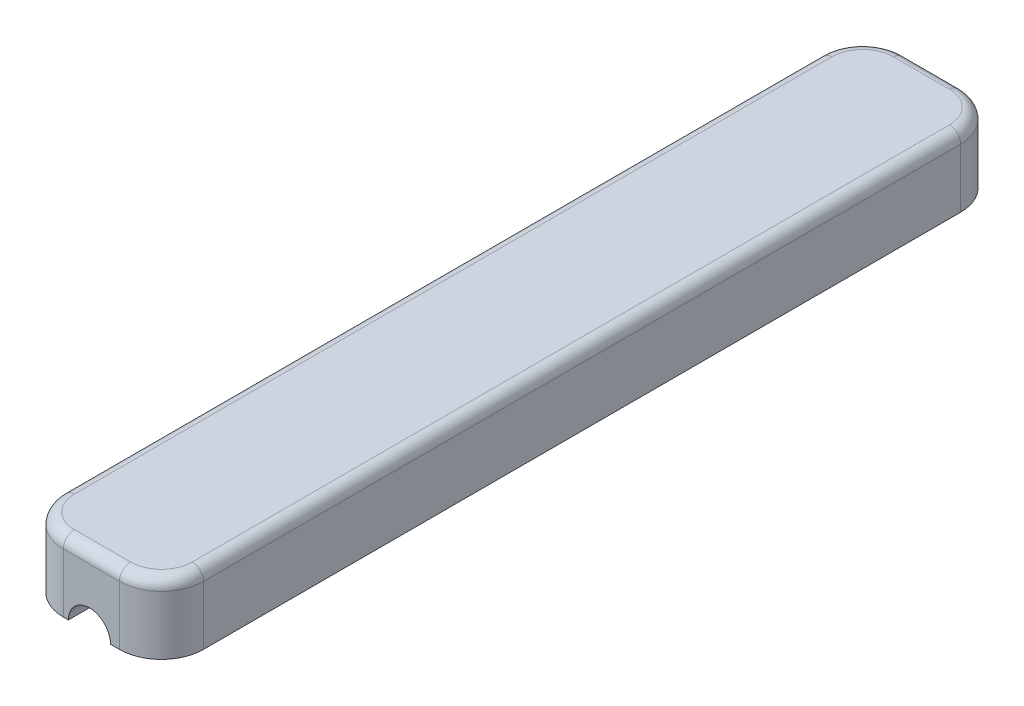
ISO-10303-21;
HEADER;
FILE_DESCRIPTION(('STEP AP214'),'2;1');
FILE_NAME('part.step','',(''),(''),'','','');
FILE_SCHEMA(('AUTOMOTIVE_DESIGN { 1 0 10303 214 1 1 1 1 }'));
ENDSEC;
DATA;
#1=APPLICATION_CONTEXT('core data for automotive mechanical design processes');
#2=APPLICATION_PROTOCOL_DEFINITION('international standard','automotive_design',2000,#1);
#3=PRODUCT_CONTEXT('',#1,'mechanical');
#4=PRODUCT('Part','Part','',(#3));
#5=PRODUCT_RELATED_PRODUCT_CATEGORY('part','',(#4));
#6=PRODUCT_DEFINITION_FORMATION('','',#4);
#7=PRODUCT_DEFINITION_CONTEXT('part definition',#1,'design');
#8=PRODUCT_DEFINITION('design','',#6,#7);
#9=PRODUCT_DEFINITION_SHAPE('','',#8);
#10=(LENGTH_UNIT() NAMED_UNIT(*) SI_UNIT(.MILLI.,.METRE.));
#11=(NAMED_UNIT(*) PLANE_ANGLE_UNIT() SI_UNIT($,.RADIAN.));
#12=(NAMED_UNIT(*) SI_UNIT($,.STERADIAN.) SOLID_ANGLE_UNIT());
#13=UNCERTAINTY_MEASURE_WITH_UNIT(LENGTH_MEASURE(1.E-05),#10,'distance_accuracy_value','');
#14=(GEOMETRIC_REPRESENTATION_CONTEXT(3) GLOBAL_UNCERTAINTY_ASSIGNED_CONTEXT((#13)) GLOBAL_UNIT_ASSIGNED_CONTEXT((#10,
#11,#12)) REPRESENTATION_CONTEXT('',''));
#15=CARTESIAN_POINT('',(0.,0.,0.));
#16=DIRECTION('',(0.,0.,1.));
#17=DIRECTION('',(1.,0.,0.));
#18=AXIS2_PLACEMENT_3D('',#15,#16,#17);
#19=CARTESIAN_POINT('',(50.,-12.5,150.));
#20=DIRECTION('',(0.,1.,0.));
#21=DIRECTION('',(0.,0.,1.));
#22=AXIS2_PLACEMENT_3D('',#19,#20,#21);
#23=PLANE('',#22);
#24=DIRECTION('',(-1.,0.,0.));
#25=VECTOR('',#24,1.);
#26=CARTESIAN_POINT('',(50.,-12.5,-150.));
#27=LINE('',#26,#25);
#28=CARTESIAN_POINT('',(16.8239431368066,-12.5,-150.));
#29=VERTEX_POINT('',#28);
#30=CARTESIAN_POINT('',(15.,-12.5,-150.));
#31=VERTEX_POINT('',#30);
#32=EDGE_CURVE('E174',#29,#31,#27,.T.);
#33=ORIENTED_EDGE('',*,*,#32,.F.);
#34=DIRECTION('',(0.,0.,1.));
#35=VECTOR('',#34,1.);
#36=CARTESIAN_POINT('',(16.8239431368066,-12.5,-150.));
#37=LINE('',#36,#35);
#38=CARTESIAN_POINT('',(16.8239431368066,-12.5,150.));
#39=VERTEX_POINT('',#38);
#40=EDGE_CURVE('E151',#29,#39,#37,.T.);
#41=ORIENTED_EDGE('',*,*,#40,.T.);
#42=DIRECTION('',(-1.,0.,0.));
#43=VECTOR('',#42,1.);
#44=CARTESIAN_POINT('',(50.,-12.5,150.));
#45=LINE('',#44,#43);
#46=CARTESIAN_POINT('',(15.,-12.5,150.));
#47=VERTEX_POINT('',#46);
#48=EDGE_CURVE('E73',#39,#47,#45,.T.);
#49=ORIENTED_EDGE('',*,*,#48,.T.);
#50=CARTESIAN_POINT('',(15.,-12.5,135.));
#51=DIRECTION('',(0.,1.,0.));
#52=DIRECTION('',(0.,0.,1.));
#53=AXIS2_PLACEMENT_3D('',#50,#51,#52);
#54=CIRCLE('',#53,15.);
#55=CARTESIAN_POINT('',(0.,-12.5,135.));
#56=VERTEX_POINT('',#55);
#57=EDGE_CURVE('E264',#47,#56,#54,.F.);
#58=ORIENTED_EDGE('',*,*,#57,.T.);
#59=DIRECTION('',(0.,0.,-1.));
#60=VECTOR('',#59,1.);
#61=CARTESIAN_POINT('',(0.,-12.5,150.));
#62=LINE('',#61,#60);
#63=CARTESIAN_POINT('',(0.,-12.5,-135.));
#64=VERTEX_POINT('',#63);
#65=EDGE_CURVE('E286',#56,#64,#62,.T.);
#66=ORIENTED_EDGE('',*,*,#65,.T.);
#67=CARTESIAN_POINT('',(15.,-12.5,-135.));
#68=DIRECTION('',(0.,1.,0.));
#69=DIRECTION('',(0.,0.,1.));
#70=AXIS2_PLACEMENT_3D('',#67,#68,#69);
#71=CIRCLE('',#70,15.);
#72=EDGE_CURVE('E270',#64,#31,#71,.F.);
#73=ORIENTED_EDGE('',*,*,#72,.T.);
#74=EDGE_LOOP('',(#33,#41,#49,#58,#66,#73));
#75=FACE_BOUND('',#74,.T.);
#76=ADVANCED_FACE('F47',(#75),#23,.F.);
#77=CARTESIAN_POINT('',(50.,12.5,150.));
#78=DIRECTION('',(0.,1.,0.));
#79=DIRECTION('',(0.,0.,1.));
#80=AXIS2_PLACEMENT_3D('',#77,#78,#79);
#81=PLANE('',#80);
#82=CARTESIAN_POINT('',(35.,12.5,135.));
#83=DIRECTION('',(0.,1.,0.));
#84=DIRECTION('',(0.,0.,1.));
#85=AXIS2_PLACEMENT_3D('',#82,#83,#84);
#86=CIRCLE('',#85,11.);
#87=CARTESIAN_POINT('',(46.,12.5,135.));
#88=VERTEX_POINT('',#87);
#89=CARTESIAN_POINT('',(35.,12.5,146.));
#90=VERTEX_POINT('',#89);
#91=EDGE_CURVE('E228',#88,#90,#86,.F.);
#92=ORIENTED_EDGE('',*,*,#91,.F.);
#93=DIRECTION('',(0.,0.,-1.));
#94=VECTOR('',#93,1.);
#95=CARTESIAN_POINT('',(46.,12.5,150.));
#96=LINE('',#95,#94);
#97=CARTESIAN_POINT('',(46.,12.5,-135.));
#98=VERTEX_POINT('',#97);
#99=EDGE_CURVE('E173',#88,#98,#96,.T.);
#100=ORIENTED_EDGE('',*,*,#99,.T.);
#101=CARTESIAN_POINT('',(35.,12.5,-135.));
#102=DIRECTION('',(0.,1.,0.));
#103=DIRECTION('',(0.,0.,1.));
#104=AXIS2_PLACEMENT_3D('',#101,#102,#103);
#105=CIRCLE('',#104,11.);
#106=CARTESIAN_POINT('',(35.,12.5,-146.));
#107=VERTEX_POINT('',#106);
#108=EDGE_CURVE('E221',#107,#98,#105,.F.);
#109=ORIENTED_EDGE('',*,*,#108,.F.);
#110=DIRECTION('',(-1.,0.,0.));
#111=VECTOR('',#110,1.);
#112=CARTESIAN_POINT('',(0.,12.5,-146.));
#113=LINE('',#112,#111);
#114=CARTESIAN_POINT('',(15.,12.5,-146.));
#115=VERTEX_POINT('',#114);
#116=EDGE_CURVE('E187',#107,#115,#113,.T.);
#117=ORIENTED_EDGE('',*,*,#116,.T.);
#118=CARTESIAN_POINT('',(15.,12.5,-135.));
#119=DIRECTION('',(0.,1.,0.));
#120=DIRECTION('',(0.,0.,1.));
#121=AXIS2_PLACEMENT_3D('',#118,#119,#120);
#122=CIRCLE('',#121,11.);
#123=CARTESIAN_POINT('',(4.,12.5,-135.));
#124=VERTEX_POINT('',#123);
#125=EDGE_CURVE('E217',#124,#115,#122,.F.);
#126=ORIENTED_EDGE('',*,*,#125,.F.);
#127=DIRECTION('',(0.,0.,-1.));
#128=VECTOR('',#127,1.);
#129=CARTESIAN_POINT('',(4.,12.5,150.));
#130=LINE('',#129,#128);
#131=CARTESIAN_POINT('',(4.,12.5,135.));
#132=VERTEX_POINT('',#131);
#133=EDGE_CURVE('E191',#124,#132,#130,.F.);
#134=ORIENTED_EDGE('',*,*,#133,.T.);
#135=CARTESIAN_POINT('',(15.,12.5,135.));
#136=DIRECTION('',(0.,1.,0.));
#137=DIRECTION('',(0.,0.,1.));
#138=AXIS2_PLACEMENT_3D('',#135,#136,#137);
#139=CIRCLE('',#138,11.);
#140=CARTESIAN_POINT('',(15.,12.5,146.));
#141=VERTEX_POINT('',#140);
#142=EDGE_CURVE('E224',#141,#132,#139,.F.);
#143=ORIENTED_EDGE('',*,*,#142,.F.);
#144=DIRECTION('',(-1.,0.,0.));
#145=VECTOR('',#144,1.);
#146=CARTESIAN_POINT('',(50.,12.5,146.));
#147=LINE('',#146,#145);
#148=EDGE_CURVE('E179',#141,#90,#147,.F.);
#149=ORIENTED_EDGE('',*,*,#148,.T.);
#150=EDGE_LOOP('',(#92,#100,#109,#117,#126,#134,#143,#149));
#151=FACE_BOUND('',#150,.T.);
#152=ADVANCED_FACE('F329',(#151),#81,.T.);
#153=CARTESIAN_POINT('',(35.,-12.5,150.));
#154=VERTEX_POINT('',#153);
#155=CARTESIAN_POINT('',(31.8239431368066,-12.5,150.));
#156=VERTEX_POINT('',#155);
#157=EDGE_CURVE('E165',#154,#156,#45,.T.);
#158=ORIENTED_EDGE('',*,*,#157,.T.);
#159=DIRECTION('',(0.,0.,1.));
#160=VECTOR('',#159,1.);
#161=CARTESIAN_POINT('',(31.8239431368066,-12.5,-150.));
#162=LINE('',#161,#160);
#163=CARTESIAN_POINT('',(31.8239431368066,-12.5,-150.));
#164=VERTEX_POINT('',#163);
#165=EDGE_CURVE('E65',#156,#164,#162,.F.);
#166=ORIENTED_EDGE('',*,*,#165,.T.);
#167=CARTESIAN_POINT('',(35.,-12.5,-150.));
#168=VERTEX_POINT('',#167);
#169=EDGE_CURVE('E162',#168,#164,#27,.T.);
#170=ORIENTED_EDGE('',*,*,#169,.F.);
#171=CARTESIAN_POINT('',(35.,-12.5,-135.));
#172=DIRECTION('',(0.,1.,0.));
#173=DIRECTION('',(0.,0.,1.));
#174=AXIS2_PLACEMENT_3D('',#171,#172,#173);
#175=CIRCLE('',#174,15.);
#176=CARTESIAN_POINT('',(50.,-12.5,-135.));
#177=VERTEX_POINT('',#176);
#178=EDGE_CURVE('E267',#168,#177,#175,.F.);
#179=ORIENTED_EDGE('',*,*,#178,.T.);
#180=DIRECTION('',(0.,0.,-1.));
#181=VECTOR('',#180,1.);
#182=CARTESIAN_POINT('',(50.,-12.5,150.));
#183=LINE('',#182,#181);
#184=CARTESIAN_POINT('',(50.,-12.5,135.));
#185=VERTEX_POINT('',#184);
#186=EDGE_CURVE('E305',#185,#177,#183,.T.);
#187=ORIENTED_EDGE('',*,*,#186,.F.);
#188=CARTESIAN_POINT('',(35.,-12.5,135.));
#189=DIRECTION('',(0.,1.,0.));
#190=DIRECTION('',(0.,0.,1.));
#191=AXIS2_PLACEMENT_3D('',#188,#189,#190);
#192=CIRCLE('',#191,15.);
#193=EDGE_CURVE('E261',#185,#154,#192,.F.);
#194=ORIENTED_EDGE('',*,*,#193,.T.);
#195=EDGE_LOOP('',(#158,#166,#170,#179,#187,#194));
#196=FACE_BOUND('',#195,.T.);
#197=ADVANCED_FACE('F161',(#196),#23,.F.);
#198=CARTESIAN_POINT('',(50.,-12.5,-150.));
#199=DIRECTION('',(0.,0.,1.));
#200=DIRECTION('',(1.,0.,0.));
#201=AXIS2_PLACEMENT_3D('',#198,#199,#200);
#202=PLANE('',#201);
#203=ORIENTED_EDGE('',*,*,#169,.T.);
#204=CARTESIAN_POINT('',(24.3239431368066,-12.5,-150.));
#205=DIRECTION('',(0.,0.,1.));
#206=DIRECTION('',(1.,0.,0.));
#207=AXIS2_PLACEMENT_3D('',#204,#205,#206);
#208=CIRCLE('',#207,7.5);
#209=EDGE_CURVE('E149',#164,#29,#208,.T.);
#210=ORIENTED_EDGE('',*,*,#209,.T.);
#211=ORIENTED_EDGE('',*,*,#32,.T.);
#212=DIRECTION('',(0.,1.,0.));
#213=VECTOR('',#212,1.);
#214=CARTESIAN_POINT('',(15.,-12.5,-150.));
#215=LINE('',#214,#213);
#216=CARTESIAN_POINT('',(15.,8.5,-150.));
#217=VERTEX_POINT('',#216);
#218=EDGE_CURVE('E252',#31,#217,#215,.T.);
#219=ORIENTED_EDGE('',*,*,#218,.T.);
#220=DIRECTION('',(-1.,0.,0.));
#221=VECTOR('',#220,1.);
#222=CARTESIAN_POINT('',(50.,8.5,-150.));
#223=LINE('',#222,#221);
#224=CARTESIAN_POINT('',(35.,8.5,-150.));
#225=VERTEX_POINT('',#224);
#226=EDGE_CURVE('E195',#217,#225,#223,.F.);
#227=ORIENTED_EDGE('',*,*,#226,.T.);
#228=DIRECTION('',(0.,1.,0.));
#229=VECTOR('',#228,1.);
#230=CARTESIAN_POINT('',(35.,-12.5,-150.));
#231=LINE('',#230,#229);
#232=EDGE_CURVE('E171',#225,#168,#231,.F.);
#233=ORIENTED_EDGE('',*,*,#232,.T.);
#234=EDGE_LOOP('',(#203,#210,#211,#219,#227,#233));
#235=FACE_BOUND('',#234,.T.);
#236=ADVANCED_FACE('F168',(#235),#202,.F.);
#237=CARTESIAN_POINT('',(50.,-12.5,150.));
#238=DIRECTION('',(0.,0.,1.));
#239=DIRECTION('',(1.,0.,0.));
#240=AXIS2_PLACEMENT_3D('',#237,#238,#239);
#241=PLANE('',#240);
#242=CARTESIAN_POINT('',(24.3239431368066,-12.5,150.));
#243=DIRECTION('',(0.,0.,1.));
#244=DIRECTION('',(1.,0.,0.));
#245=AXIS2_PLACEMENT_3D('',#242,#243,#244);
#246=CIRCLE('',#245,7.5);
#247=EDGE_CURVE('E156',#156,#39,#246,.T.);
#248=ORIENTED_EDGE('',*,*,#247,.F.);
#249=ORIENTED_EDGE('',*,*,#157,.F.);
#250=DIRECTION('',(0.,1.,0.));
#251=VECTOR('',#250,1.);
#252=CARTESIAN_POINT('',(35.,-12.5,150.));
#253=LINE('',#252,#251);
#254=CARTESIAN_POINT('',(35.,8.5,150.));
#255=VERTEX_POINT('',#254);
#256=EDGE_CURVE('E57',#154,#255,#253,.T.);
#257=ORIENTED_EDGE('',*,*,#256,.T.);
#258=DIRECTION('',(-1.,0.,0.));
#259=VECTOR('',#258,1.);
#260=CARTESIAN_POINT('',(50.,8.5,150.));
#261=LINE('',#260,#259);
#262=CARTESIAN_POINT('',(15.,8.5,150.));
#263=VERTEX_POINT('',#262);
#264=EDGE_CURVE('E198',#255,#263,#261,.T.);
#265=ORIENTED_EDGE('',*,*,#264,.T.);
#266=DIRECTION('',(0.,1.,0.));
#267=VECTOR('',#266,1.);
#268=CARTESIAN_POINT('',(15.,-12.5,150.));
#269=LINE('',#268,#267);
#270=EDGE_CURVE('E11',#263,#47,#269,.F.);
#271=ORIENTED_EDGE('',*,*,#270,.T.);
#272=ORIENTED_EDGE('',*,*,#48,.F.);
#273=EDGE_LOOP('',(#248,#249,#257,#265,#271,#272));
#274=FACE_BOUND('',#273,.T.);
#275=ADVANCED_FACE('F376',(#274),#241,.T.);
#276=CARTESIAN_POINT('',(50.,0.,0.));
#277=DIRECTION('',(1.,0.,0.));
#278=DIRECTION('',(0.,0.,-1.));
#279=AXIS2_PLACEMENT_3D('',#276,#277,#278);
#280=PLANE('',#279);
#281=ORIENTED_EDGE('',*,*,#186,.T.);
#282=DIRECTION('',(0.,1.,0.));
#283=VECTOR('',#282,1.);
#284=CARTESIAN_POINT('',(50.,8.5,-135.));
#285=LINE('',#284,#283);
#286=CARTESIAN_POINT('',(50.,8.5,-135.));
#287=VERTEX_POINT('',#286);
#288=EDGE_CURVE('E277',#177,#287,#285,.T.);
#289=ORIENTED_EDGE('',*,*,#288,.T.);
#290=DIRECTION('',(0.,0.,-1.));
#291=VECTOR('',#290,1.);
#292=CARTESIAN_POINT('',(50.,8.5,0.));
#293=LINE('',#292,#291);
#294=CARTESIAN_POINT('',(50.,8.5,135.));
#295=VERTEX_POINT('',#294);
#296=EDGE_CURVE('E206',#287,#295,#293,.F.);
#297=ORIENTED_EDGE('',*,*,#296,.T.);
#298=DIRECTION('',(0.,1.,0.));
#299=VECTOR('',#298,1.);
#300=CARTESIAN_POINT('',(50.,0.,135.));
#301=LINE('',#300,#299);
#302=EDGE_CURVE('E274',#295,#185,#301,.F.);
#303=ORIENTED_EDGE('',*,*,#302,.T.);
#304=EDGE_LOOP('',(#281,#289,#297,#303));
#305=FACE_BOUND('',#304,.T.);
#306=ADVANCED_FACE('F348',(#305),#280,.T.);
#307=CARTESIAN_POINT('',(0.,0.,0.));
#308=DIRECTION('',(1.,0.,0.));
#309=DIRECTION('',(0.,0.,-1.));
#310=AXIS2_PLACEMENT_3D('',#307,#308,#309);
#311=PLANE('',#310);
#312=DIRECTION('',(0.,0.,-1.));
#313=VECTOR('',#312,1.);
#314=CARTESIAN_POINT('',(0.,8.5,-150.));
#315=LINE('',#314,#313);
#316=CARTESIAN_POINT('',(0.,8.5,135.));
#317=VERTEX_POINT('',#316);
#318=CARTESIAN_POINT('',(0.,8.5,-135.));
#319=VERTEX_POINT('',#318);
#320=EDGE_CURVE('E202',#317,#319,#315,.T.);
#321=ORIENTED_EDGE('',*,*,#320,.T.);
#322=DIRECTION('',(0.,1.,0.));
#323=VECTOR('',#322,1.);
#324=CARTESIAN_POINT('',(0.,0.,-135.));
#325=LINE('',#324,#323);
#326=EDGE_CURVE('E258',#319,#64,#325,.F.);
#327=ORIENTED_EDGE('',*,*,#326,.T.);
#328=ORIENTED_EDGE('',*,*,#65,.F.);
#329=DIRECTION('',(0.,1.,0.));
#330=VECTOR('',#329,1.);
#331=CARTESIAN_POINT('',(0.,8.5,135.));
#332=LINE('',#331,#330);
#333=EDGE_CURVE('E255',#56,#317,#332,.T.);
#334=ORIENTED_EDGE('',*,*,#333,.T.);
#335=EDGE_LOOP('',(#321,#327,#328,#334));
#336=FACE_BOUND('',#335,.T.);
#337=ADVANCED_FACE('F382',(#336),#311,.F.);
#338=CARTESIAN_POINT('',(50.,8.5,146.));
#339=DIRECTION('',(-1.,0.,0.));
#340=DIRECTION('',(0.,0.,1.));
#341=AXIS2_PLACEMENT_3D('',#338,#339,#340);
#342=CYLINDRICAL_SURFACE('',#341,4.);
#343=ORIENTED_EDGE('',*,*,#264,.F.);
#344=CARTESIAN_POINT('',(35.,8.5,146.));
#345=DIRECTION('',(-1.,0.,0.));
#346=DIRECTION('',(0.,0.,1.));
#347=AXIS2_PLACEMENT_3D('',#344,#345,#346);
#348=CIRCLE('',#347,4.);
#349=EDGE_CURVE('E213',#255,#90,#348,.T.);
#350=ORIENTED_EDGE('',*,*,#349,.T.);
#351=ORIENTED_EDGE('',*,*,#148,.F.);
#352=CARTESIAN_POINT('',(15.,8.5,146.));
#353=DIRECTION('',(1.,0.,0.));
#354=DIRECTION('',(0.,0.,-1.));
#355=AXIS2_PLACEMENT_3D('',#352,#353,#354);
#356=CIRCLE('',#355,4.);
#357=EDGE_CURVE('E210',#141,#263,#356,.T.);
#358=ORIENTED_EDGE('',*,*,#357,.T.);
#359=EDGE_LOOP('',(#343,#350,#351,#358));
#360=FACE_BOUND('',#359,.T.);
#361=ADVANCED_FACE('F337',(#360),#342,.T.);
#362=CARTESIAN_POINT('',(46.,8.5,150.));
#363=DIRECTION('',(0.,0.,-1.));
#364=DIRECTION('',(-1.,0.,0.));
#365=AXIS2_PLACEMENT_3D('',#362,#363,#364);
#366=CYLINDRICAL_SURFACE('',#365,4.);
#367=ORIENTED_EDGE('',*,*,#296,.F.);
#368=CARTESIAN_POINT('',(46.,8.5,-135.));
#369=DIRECTION('',(0.,0.,1.));
#370=DIRECTION('',(1.,0.,0.));
#371=AXIS2_PLACEMENT_3D('',#368,#369,#370);
#372=CIRCLE('',#371,4.);
#373=EDGE_CURVE('E240',#287,#98,#372,.T.);
#374=ORIENTED_EDGE('',*,*,#373,.T.);
#375=ORIENTED_EDGE('',*,*,#99,.F.);
#376=CARTESIAN_POINT('',(46.,8.5,135.));
#377=DIRECTION('',(0.,0.,-1.));
#378=DIRECTION('',(-1.,0.,0.));
#379=AXIS2_PLACEMENT_3D('',#376,#377,#378);
#380=CIRCLE('',#379,4.);
#381=EDGE_CURVE('E237',#88,#295,#380,.T.);
#382=ORIENTED_EDGE('',*,*,#381,.T.);
#383=EDGE_LOOP('',(#367,#374,#375,#382));
#384=FACE_BOUND('',#383,.T.);
#385=ADVANCED_FACE('F327',(#384),#366,.T.);
#386=CARTESIAN_POINT('',(4.,8.5,0.));
#387=DIRECTION('',(0.,0.,1.));
#388=DIRECTION('',(1.,0.,0.));
#389=AXIS2_PLACEMENT_3D('',#386,#387,#388);
#390=CYLINDRICAL_SURFACE('',#389,4.);
#391=ORIENTED_EDGE('',*,*,#320,.F.);
#392=CARTESIAN_POINT('',(4.,8.5,135.));
#393=DIRECTION('',(0.,0.,-1.));
#394=DIRECTION('',(-1.,0.,0.));
#395=AXIS2_PLACEMENT_3D('',#392,#393,#394);
#396=CIRCLE('',#395,4.);
#397=EDGE_CURVE('E234',#317,#132,#396,.T.);
#398=ORIENTED_EDGE('',*,*,#397,.T.);
#399=ORIENTED_EDGE('',*,*,#133,.F.);
#400=CARTESIAN_POINT('',(4.,8.5,-135.));
#401=DIRECTION('',(0.,0.,1.));
#402=DIRECTION('',(1.,0.,0.));
#403=AXIS2_PLACEMENT_3D('',#400,#401,#402);
#404=CIRCLE('',#403,4.);
#405=EDGE_CURVE('E231',#124,#319,#404,.T.);
#406=ORIENTED_EDGE('',*,*,#405,.T.);
#407=EDGE_LOOP('',(#391,#398,#399,#406));
#408=FACE_BOUND('',#407,.T.);
#409=ADVANCED_FACE('F398',(#408),#390,.T.);
#410=CARTESIAN_POINT('',(50.,8.5,-146.));
#411=DIRECTION('',(1.,0.,0.));
#412=DIRECTION('',(0.,0.,-1.));
#413=AXIS2_PLACEMENT_3D('',#410,#411,#412);
#414=CYLINDRICAL_SURFACE('',#413,4.);
#415=ORIENTED_EDGE('',*,*,#226,.F.);
#416=CARTESIAN_POINT('',(15.,8.5,-146.));
#417=DIRECTION('',(1.,0.,0.));
#418=DIRECTION('',(0.,0.,-1.));
#419=AXIS2_PLACEMENT_3D('',#416,#417,#418);
#420=CIRCLE('',#419,4.);
#421=EDGE_CURVE('E247',#217,#115,#420,.T.);
#422=ORIENTED_EDGE('',*,*,#421,.T.);
#423=ORIENTED_EDGE('',*,*,#116,.F.);
#424=CARTESIAN_POINT('',(35.,8.5,-146.));
#425=DIRECTION('',(-1.,0.,0.));
#426=DIRECTION('',(0.,0.,1.));
#427=AXIS2_PLACEMENT_3D('',#424,#425,#426);
#428=CIRCLE('',#427,4.);
#429=EDGE_CURVE('E244',#107,#225,#428,.T.);
#430=ORIENTED_EDGE('',*,*,#429,.T.);
#431=EDGE_LOOP('',(#415,#422,#423,#430));
#432=FACE_BOUND('',#431,.T.);
#433=ADVANCED_FACE('F320',(#432),#414,.T.);
#434=CARTESIAN_POINT('',(35.,-12.5,135.));
#435=DIRECTION('',(0.,1.,0.));
#436=DIRECTION('',(0.,0.,1.));
#437=AXIS2_PLACEMENT_3D('',#434,#435,#436);
#438=CYLINDRICAL_SURFACE('',#437,15.);
#439=ORIENTED_EDGE('',*,*,#193,.F.);
#440=ORIENTED_EDGE('',*,*,#302,.F.);
#441=CARTESIAN_POINT('',(35.,8.5,135.));
#442=DIRECTION('',(0.,1.,0.));
#443=DIRECTION('',(0.,0.,1.));
#444=AXIS2_PLACEMENT_3D('',#441,#442,#443);
#445=CIRCLE('',#444,15.);
#446=EDGE_CURVE('E282',#255,#295,#445,.T.);
#447=ORIENTED_EDGE('',*,*,#446,.F.);
#448=ORIENTED_EDGE('',*,*,#256,.F.);
#449=EDGE_LOOP('',(#439,#440,#447,#448));
#450=FACE_BOUND('',#449,.T.);
#451=ADVANCED_FACE('F345',(#450),#438,.T.);
#452=CARTESIAN_POINT('',(35.,8.5,135.));
#453=DIRECTION('',(0.,1.,0.));
#454=DIRECTION('',(0.,0.,1.));
#455=AXIS2_PLACEMENT_3D('',#452,#453,#454);
#456=TOROIDAL_SURFACE('',#455,11.,4.);
#457=ORIENTED_EDGE('',*,*,#349,.F.);
#458=ORIENTED_EDGE('',*,*,#446,.T.);
#459=ORIENTED_EDGE('',*,*,#381,.F.);
#460=ORIENTED_EDGE('',*,*,#91,.T.);
#461=EDGE_LOOP('',(#457,#458,#459,#460));
#462=FACE_BOUND('',#461,.T.);
#463=ADVANCED_FACE('F334',(#462),#456,.T.);
#464=CARTESIAN_POINT('',(15.,0.,135.));
#465=DIRECTION('',(0.,-1.,0.));
#466=DIRECTION('',(0.,0.,-1.));
#467=AXIS2_PLACEMENT_3D('',#464,#465,#466);
#468=CYLINDRICAL_SURFACE('',#467,15.);
#469=ORIENTED_EDGE('',*,*,#57,.F.);
#470=ORIENTED_EDGE('',*,*,#270,.F.);
#471=CARTESIAN_POINT('',(15.,8.5,135.));
#472=DIRECTION('',(0.,1.,0.));
#473=DIRECTION('',(0.,0.,1.));
#474=AXIS2_PLACEMENT_3D('',#471,#472,#473);
#475=CIRCLE('',#474,15.);
#476=EDGE_CURVE('E287',#317,#263,#475,.T.);
#477=ORIENTED_EDGE('',*,*,#476,.F.);
#478=ORIENTED_EDGE('',*,*,#333,.F.);
#479=EDGE_LOOP('',(#469,#470,#477,#478));
#480=FACE_BOUND('',#479,.T.);
#481=ADVANCED_FACE('F360',(#480),#468,.T.);
#482=CARTESIAN_POINT('',(15.,8.5,135.));
#483=DIRECTION('',(0.,1.,0.));
#484=DIRECTION('',(0.,0.,1.));
#485=AXIS2_PLACEMENT_3D('',#482,#483,#484);
#486=TOROIDAL_SURFACE('',#485,11.,4.);
#487=ORIENTED_EDGE('',*,*,#357,.F.);
#488=ORIENTED_EDGE('',*,*,#142,.T.);
#489=ORIENTED_EDGE('',*,*,#397,.F.);
#490=ORIENTED_EDGE('',*,*,#476,.T.);
#491=EDGE_LOOP('',(#487,#488,#489,#490));
#492=FACE_BOUND('',#491,.T.);
#493=ADVANCED_FACE('F353',(#492),#486,.T.);
#494=CARTESIAN_POINT('',(35.,0.,-135.));
#495=DIRECTION('',(0.,-1.,0.));
#496=DIRECTION('',(0.,0.,-1.));
#497=AXIS2_PLACEMENT_3D('',#494,#495,#496);
#498=CYLINDRICAL_SURFACE('',#497,15.);
#499=ORIENTED_EDGE('',*,*,#178,.F.);
#500=ORIENTED_EDGE('',*,*,#232,.F.);
#501=CARTESIAN_POINT('',(35.,8.5,-135.));
#502=DIRECTION('',(0.,1.,0.));
#503=DIRECTION('',(0.,0.,1.));
#504=AXIS2_PLACEMENT_3D('',#501,#502,#503);
#505=CIRCLE('',#504,15.);
#506=EDGE_CURVE('E290',#287,#225,#505,.T.);
#507=ORIENTED_EDGE('',*,*,#506,.F.);
#508=ORIENTED_EDGE('',*,*,#288,.F.);
#509=EDGE_LOOP('',(#499,#500,#507,#508));
#510=FACE_BOUND('',#509,.T.);
#511=ADVANCED_FACE('F351',(#510),#498,.T.);
#512=CARTESIAN_POINT('',(35.,8.5,-135.));
#513=DIRECTION('',(0.,1.,0.));
#514=DIRECTION('',(0.,0.,1.));
#515=AXIS2_PLACEMENT_3D('',#512,#513,#514);
#516=TOROIDAL_SURFACE('',#515,11.,4.);
#517=ORIENTED_EDGE('',*,*,#373,.F.);
#518=ORIENTED_EDGE('',*,*,#506,.T.);
#519=ORIENTED_EDGE('',*,*,#429,.F.);
#520=ORIENTED_EDGE('',*,*,#108,.T.);
#521=EDGE_LOOP('',(#517,#518,#519,#520));
#522=FACE_BOUND('',#521,.T.);
#523=ADVANCED_FACE('F322',(#522),#516,.T.);
#524=CARTESIAN_POINT('',(15.,-12.5,-135.));
#525=DIRECTION('',(0.,1.,0.));
#526=DIRECTION('',(0.,0.,1.));
#527=AXIS2_PLACEMENT_3D('',#524,#525,#526);
#528=CYLINDRICAL_SURFACE('',#527,15.);
#529=ORIENTED_EDGE('',*,*,#72,.F.);
#530=ORIENTED_EDGE('',*,*,#326,.F.);
#531=CARTESIAN_POINT('',(15.,8.5,-135.));
#532=DIRECTION('',(0.,1.,0.));
#533=DIRECTION('',(0.,0.,1.));
#534=AXIS2_PLACEMENT_3D('',#531,#532,#533);
#535=CIRCLE('',#534,15.);
#536=EDGE_CURVE('E51',#217,#319,#535,.T.);
#537=ORIENTED_EDGE('',*,*,#536,.F.);
#538=ORIENTED_EDGE('',*,*,#218,.F.);
#539=EDGE_LOOP('',(#529,#530,#537,#538));
#540=FACE_BOUND('',#539,.T.);
#541=ADVANCED_FACE('F49',(#540),#528,.T.);
#542=CARTESIAN_POINT('',(15.,8.5,-135.));
#543=DIRECTION('',(0.,1.,0.));
#544=DIRECTION('',(0.,0.,1.));
#545=AXIS2_PLACEMENT_3D('',#542,#543,#544);
#546=TOROIDAL_SURFACE('',#545,11.,4.);
#547=ORIENTED_EDGE('',*,*,#405,.F.);
#548=ORIENTED_EDGE('',*,*,#125,.T.);
#549=ORIENTED_EDGE('',*,*,#421,.F.);
#550=ORIENTED_EDGE('',*,*,#536,.T.);
#551=EDGE_LOOP('',(#547,#548,#549,#550));
#552=FACE_BOUND('',#551,.T.);
#553=ADVANCED_FACE('F388',(#552),#546,.T.);
#554=CARTESIAN_POINT('',(24.3239431368066,-12.5,-150.));
#555=DIRECTION('',(0.,0.,1.));
#556=DIRECTION('',(1.,0.,0.));
#557=AXIS2_PLACEMENT_3D('',#554,#555,#556);
#558=CYLINDRICAL_SURFACE('',#557,7.5);
#559=ORIENTED_EDGE('',*,*,#209,.F.);
#560=ORIENTED_EDGE('',*,*,#165,.F.);
#561=ORIENTED_EDGE('',*,*,#247,.T.);
#562=ORIENTED_EDGE('',*,*,#40,.F.);
#563=EDGE_LOOP('',(#559,#560,#561,#562));
#564=FACE_BOUND('',#563,.T.);
#565=ADVANCED_FACE('F150',(#564),#558,.F.);
#566=CLOSED_SHELL('',(#76,#152,#197,#236,#275,#306,#337,#361,#385,#409,#433,#451,#463,#481,#493,
#511,#523,#541,#553,#565));
#567=MANIFOLD_SOLID_BREP('B2',#566);
#568=ADVANCED_BREP_SHAPE_REPRESENTATION('',(#18,#567),#14);
#569=SHAPE_DEFINITION_REPRESENTATION(#9,#568);
ENDSEC;
END-ISO-10303-21;
